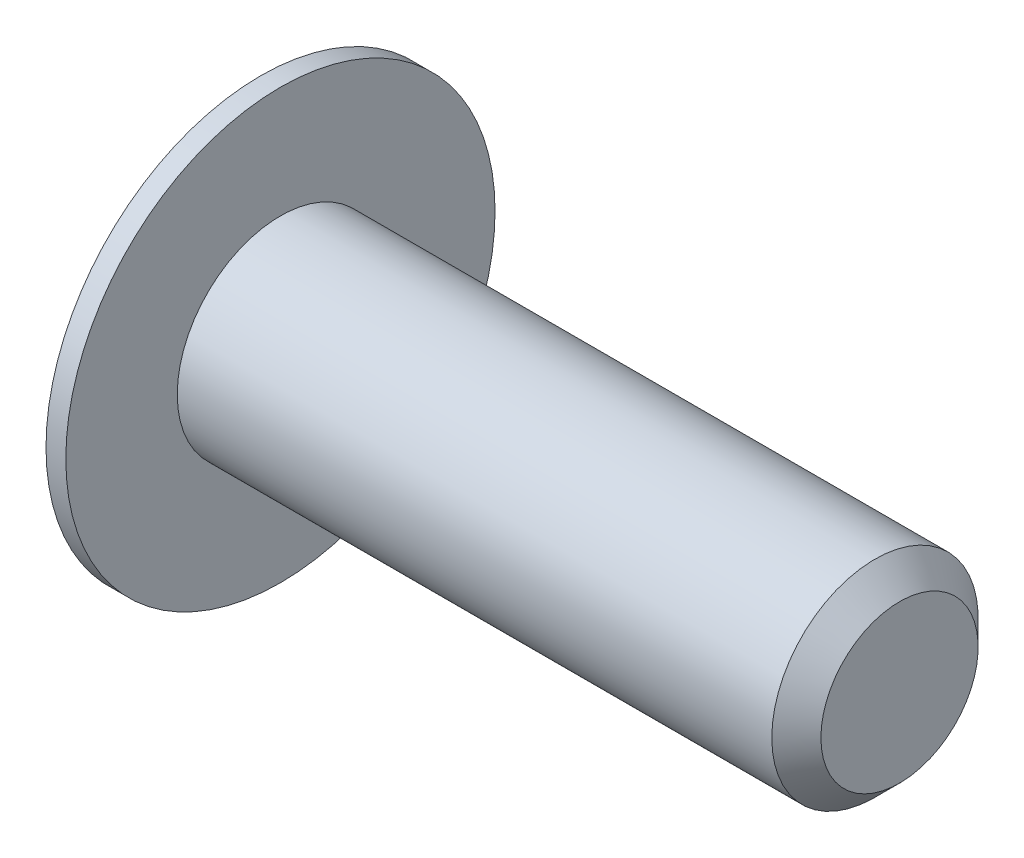
ISO-10303-21;
HEADER;
FILE_DESCRIPTION(('STEP AP214'),'2;1');
FILE_NAME('part.step','',(''),(''),'','','');
FILE_SCHEMA(('AUTOMOTIVE_DESIGN { 1 0 10303 214 1 1 1 1 }'));
ENDSEC;
DATA;
#1=APPLICATION_CONTEXT('core data for automotive mechanical design processes');
#2=APPLICATION_PROTOCOL_DEFINITION('international standard','automotive_design',2000,#1);
#3=PRODUCT_CONTEXT('',#1,'mechanical');
#4=PRODUCT('Part','Part','',(#3));
#5=PRODUCT_RELATED_PRODUCT_CATEGORY('part','',(#4));
#6=PRODUCT_DEFINITION_FORMATION('','',#4);
#7=PRODUCT_DEFINITION_CONTEXT('part definition',#1,'design');
#8=PRODUCT_DEFINITION('design','',#6,#7);
#9=PRODUCT_DEFINITION_SHAPE('','',#8);
#10=(LENGTH_UNIT() NAMED_UNIT(*) SI_UNIT(.MILLI.,.METRE.));
#11=(NAMED_UNIT(*) PLANE_ANGLE_UNIT() SI_UNIT($,.RADIAN.));
#12=(NAMED_UNIT(*) SI_UNIT($,.STERADIAN.) SOLID_ANGLE_UNIT());
#13=UNCERTAINTY_MEASURE_WITH_UNIT(LENGTH_MEASURE(1.E-05),#10,'distance_accuracy_value','');
#14=(GEOMETRIC_REPRESENTATION_CONTEXT(3) GLOBAL_UNCERTAINTY_ASSIGNED_CONTEXT((#13)) GLOBAL_UNIT_ASSIGNED_CONTEXT((#10,
#11,#12)) REPRESENTATION_CONTEXT('',''));
#15=CARTESIAN_POINT('',(0.,0.,0.));
#16=DIRECTION('',(0.,0.,1.));
#17=DIRECTION('',(1.,0.,0.));
#18=AXIS2_PLACEMENT_3D('',#15,#16,#17);
#19=CARTESIAN_POINT('',(0.,0.,0.));
#20=DIRECTION('',(-1.,0.,0.));
#21=DIRECTION('',(0.,0.,1.));
#22=AXIS2_PLACEMENT_3D('',#19,#20,#21);
#23=CYLINDRICAL_SURFACE('',#22,6.604);
#24=CARTESIAN_POINT('',(0.,0.,0.));
#25=DIRECTION('',(-1.,0.,0.));
#26=DIRECTION('',(0.,0.,1.));
#27=AXIS2_PLACEMENT_3D('',#24,#25,#26);
#28=CIRCLE('',#27,6.604);
#29=CARTESIAN_POINT('',(0.,0.,6.604));
#30=VERTEX_POINT('',#29);
#31=EDGE_CURVE('E143',#30,#30,#28,.T.);
#32=ORIENTED_EDGE('',*,*,#31,.T.);
#33=EDGE_LOOP('',(#32));
#34=FACE_BOUND('',#33,.T.);
#35=CARTESIAN_POINT('',(-0.609599999999997,0.,0.));
#36=DIRECTION('',(-1.,0.,0.));
#37=DIRECTION('',(0.,0.,1.));
#38=AXIS2_PLACEMENT_3D('',#35,#36,#37);
#39=CIRCLE('',#38,6.604);
#40=CARTESIAN_POINT('',(-0.609599999999997,0.,6.604));
#41=VERTEX_POINT('',#40);
#42=EDGE_CURVE('E134',#41,#41,#39,.T.);
#43=ORIENTED_EDGE('',*,*,#42,.F.);
#44=EDGE_LOOP('',(#43));
#45=FACE_BOUND('',#44,.T.);
#46=ADVANCED_FACE('F32',(#34,#45),#23,.T.);
#47=CARTESIAN_POINT('',(0.,6.604,0.));
#48=DIRECTION('',(1.,0.,0.));
#49=DIRECTION('',(0.,0.,-1.));
#50=AXIS2_PLACEMENT_3D('',#47,#48,#49);
#51=PLANE('',#50);
#52=CARTESIAN_POINT('',(0.,0.,0.));
#53=DIRECTION('',(1.,0.,0.));
#54=DIRECTION('',(0.,0.,-1.));
#55=AXIS2_PLACEMENT_3D('',#52,#53,#54);
#56=CIRCLE('',#55,3.175);
#57=CARTESIAN_POINT('',(0.,0.,-3.175));
#58=VERTEX_POINT('',#57);
#59=EDGE_CURVE('E140',#58,#58,#56,.T.);
#60=ORIENTED_EDGE('',*,*,#59,.F.);
#61=EDGE_LOOP('',(#60));
#62=FACE_BOUND('',#61,.T.);
#63=ORIENTED_EDGE('',*,*,#31,.F.);
#64=EDGE_LOOP('',(#63));
#65=FACE_BOUND('',#64,.T.);
#66=ADVANCED_FACE('F163',(#62,#65),#51,.T.);
#67=CARTESIAN_POINT('',(-3.048,0.,0.));
#68=DIRECTION('',(-1.,0.,0.));
#69=DIRECTION('',(0.,0.,1.));
#70=AXIS2_PLACEMENT_3D('',#67,#68,#69);
#71=PLANE('',#70);
#72=DIRECTION('',(0.,-0.499999999999994,0.866025403784442));
#73=VECTOR('',#72,1.);
#74=CARTESIAN_POINT('',(-3.048,-1.1731757469933,-2.032));
#75=LINE('',#74,#73);
#76=CARTESIAN_POINT('',(-3.048,-1.1731757469933,-2.032));
#77=VERTEX_POINT('',#76);
#78=CARTESIAN_POINT('',(-3.048,-2.3463514939866,0.));
#79=VERTEX_POINT('',#78);
#80=EDGE_CURVE('E47',#77,#79,#75,.T.);
#81=ORIENTED_EDGE('',*,*,#80,.F.);
#82=DIRECTION('',(0.,-1.,0.));
#83=VECTOR('',#82,1.);
#84=CARTESIAN_POINT('',(-3.048,1.1731757469933,-2.032));
#85=LINE('',#84,#83);
#86=CARTESIAN_POINT('',(-3.048,1.1731757469933,-2.032));
#87=VERTEX_POINT('',#86);
#88=EDGE_CURVE('E130',#87,#77,#85,.T.);
#89=ORIENTED_EDGE('',*,*,#88,.F.);
#90=DIRECTION('',(0.,-0.499999999999994,-0.866025403784442));
#91=VECTOR('',#90,1.);
#92=CARTESIAN_POINT('',(-3.048,2.3463514939866,0.));
#93=LINE('',#92,#91);
#94=CARTESIAN_POINT('',(-3.048,2.3463514939866,0.));
#95=VERTEX_POINT('',#94);
#96=EDGE_CURVE('E128',#95,#87,#93,.T.);
#97=ORIENTED_EDGE('',*,*,#96,.F.);
#98=DIRECTION('',(0.,0.499999999999994,-0.866025403784442));
#99=VECTOR('',#98,1.);
#100=CARTESIAN_POINT('',(-3.048,1.1731757469933,2.032));
#101=LINE('',#100,#99);
#102=CARTESIAN_POINT('',(-3.048,1.1731757469933,2.032));
#103=VERTEX_POINT('',#102);
#104=EDGE_CURVE('E95',#103,#95,#101,.T.);
#105=ORIENTED_EDGE('',*,*,#104,.F.);
#106=DIRECTION('',(0.,1.,0.));
#107=VECTOR('',#106,1.);
#108=CARTESIAN_POINT('',(-3.048,-1.1731757469933,2.032));
#109=LINE('',#108,#107);
#110=CARTESIAN_POINT('',(-3.048,-1.1731757469933,2.032));
#111=VERTEX_POINT('',#110);
#112=EDGE_CURVE('E124',#111,#103,#109,.T.);
#113=ORIENTED_EDGE('',*,*,#112,.F.);
#114=DIRECTION('',(0.,0.499999999999994,0.866025403784442));
#115=VECTOR('',#114,1.);
#116=CARTESIAN_POINT('',(-3.048,-2.3463514939866,0.));
#117=LINE('',#116,#115);
#118=EDGE_CURVE('E121',#79,#111,#117,.T.);
#119=ORIENTED_EDGE('',*,*,#118,.F.);
#120=EDGE_LOOP('',(#81,#89,#97,#105,#113,#119));
#121=FACE_BOUND('',#120,.T.);
#122=CARTESIAN_POINT('',(-3.048,0.,0.));
#123=DIRECTION('',(-1.,0.,0.));
#124=DIRECTION('',(0.,0.,1.));
#125=AXIS2_PLACEMENT_3D('',#122,#123,#124);
#126=CIRCLE('',#125,2.4384);
#127=CARTESIAN_POINT('',(-3.048,0.,2.4384));
#128=VERTEX_POINT('',#127);
#129=EDGE_CURVE('E179',#128,#128,#126,.T.);
#130=ORIENTED_EDGE('',*,*,#129,.T.);
#131=EDGE_LOOP('',(#130));
#132=FACE_BOUND('',#131,.T.);
#133=ADVANCED_FACE('F158',(#121,#132),#71,.T.);
#134=CARTESIAN_POINT('',(-3.048,2.4384,0.));
#135=CARTESIAN_POINT('',(-2.65656917983027,3.80682402530109,0.));
#136=CARTESIAN_POINT('',(-1.75647830409589,5.10070465916927,0.));
#137=CARTESIAN_POINT('',(-0.609600000000002,5.9436,0.));
#138=B_SPLINE_CURVE_WITH_KNOTS('',3,(#134,#135,#136,#137),.UNSPECIFIED.,.F.,.F.,(4,4),(0.,1.),.UNSPECIFIED.);
#139=CARTESIAN_POINT('',(0.,0.,0.));
#140=DIRECTION('',(-1.,0.,0.));
#141=AXIS1_PLACEMENT('',#139,#140);
#142=SURFACE_OF_REVOLUTION('',#138,#141);
#143=CARTESIAN_POINT('',(-0.609600000000002,0.,0.));
#144=DIRECTION('',(-1.,0.,0.));
#145=DIRECTION('',(0.,0.,1.));
#146=AXIS2_PLACEMENT_3D('',#143,#144,#145);
#147=CIRCLE('',#146,5.9436);
#148=CARTESIAN_POINT('',(-0.609600000000002,0.,5.9436));
#149=VERTEX_POINT('',#148);
#150=EDGE_CURVE('E177',#149,#149,#147,.T.);
#151=ORIENTED_EDGE('',*,*,#150,.T.);
#152=EDGE_LOOP('',(#151));
#153=FACE_BOUND('',#152,.T.);
#154=ORIENTED_EDGE('',*,*,#129,.F.);
#155=EDGE_LOOP('',(#154));
#156=FACE_BOUND('',#155,.T.);
#157=ADVANCED_FACE('F153',(#153,#156),#142,.F.);
#158=CARTESIAN_POINT('',(-0.6096,5.9436,0.));
#159=DIRECTION('',(-1.,0.,0.));
#160=DIRECTION('',(0.,0.,1.));
#161=AXIS2_PLACEMENT_3D('',#158,#159,#160);
#162=PLANE('',#161);
#163=ORIENTED_EDGE('',*,*,#42,.T.);
#164=EDGE_LOOP('',(#163));
#165=FACE_BOUND('',#164,.T.);
#166=ORIENTED_EDGE('',*,*,#150,.F.);
#167=EDGE_LOOP('',(#166));
#168=FACE_BOUND('',#167,.T.);
#169=ADVANCED_FACE('F157',(#165,#168),#162,.T.);
#170=CARTESIAN_POINT('',(19.05,0.,0.));
#171=DIRECTION('',(-1.,0.,0.));
#172=DIRECTION('',(0.,0.,1.));
#173=AXIS2_PLACEMENT_3D('',#170,#171,#172);
#174=CYLINDRICAL_SURFACE('',#173,3.175);
#175=CARTESIAN_POINT('',(18.29435,0.,0.));
#176=DIRECTION('',(1.,0.,0.));
#177=DIRECTION('',(0.,0.,-1.));
#178=AXIS2_PLACEMENT_3D('',#175,#176,#177);
#179=CIRCLE('',#178,3.175);
#180=CARTESIAN_POINT('',(18.29435,0.,3.175));
#181=VERTEX_POINT('',#180);
#182=EDGE_CURVE('E11',#181,#181,#179,.F.);
#183=ORIENTED_EDGE('',*,*,#182,.T.);
#184=EDGE_LOOP('',(#183));
#185=FACE_BOUND('',#184,.T.);
#186=ORIENTED_EDGE('',*,*,#59,.T.);
#187=EDGE_LOOP('',(#186));
#188=FACE_BOUND('',#187,.T.);
#189=ADVANCED_FACE('F198',(#185,#188),#174,.T.);
#190=CARTESIAN_POINT('',(19.05,0.,0.));
#191=DIRECTION('',(1.,0.,0.));
#192=DIRECTION('',(0.,0.,-1.));
#193=AXIS2_PLACEMENT_3D('',#190,#191,#192);
#194=PLANE('',#193);
#195=CARTESIAN_POINT('',(19.05,0.,0.));
#196=DIRECTION('',(1.,0.,0.));
#197=DIRECTION('',(0.,0.,-1.));
#198=AXIS2_PLACEMENT_3D('',#195,#196,#197);
#199=CIRCLE('',#198,2.41935);
#200=CARTESIAN_POINT('',(19.05,0.,2.41935));
#201=VERTEX_POINT('',#200);
#202=EDGE_CURVE('E40',#201,#201,#199,.T.);
#203=ORIENTED_EDGE('',*,*,#202,.T.);
#204=EDGE_LOOP('',(#203));
#205=FACE_BOUND('',#204,.T.);
#206=ADVANCED_FACE('F187',(#205),#194,.T.);
#207=CARTESIAN_POINT('',(-0.762,-1.1731757469933,-2.032));
#208=DIRECTION('',(0.,-0.866025403784442,-0.499999999999994));
#209=DIRECTION('',(0.,0.499999999999994,-0.866025403784442));
#210=AXIS2_PLACEMENT_3D('',#207,#208,#209);
#211=PLANE('',#210);
#212=ORIENTED_EDGE('',*,*,#80,.T.);
#213=DIRECTION('',(-1.,0.,0.));
#214=VECTOR('',#213,1.);
#215=CARTESIAN_POINT('',(-0.762,-2.3463514939866,0.));
#216=LINE('',#215,#214);
#217=CARTESIAN_POINT('',(-0.762,-2.3463514939866,0.));
#218=VERTEX_POINT('',#217);
#219=EDGE_CURVE('E77',#218,#79,#216,.T.);
#220=ORIENTED_EDGE('',*,*,#219,.F.);
#221=DIRECTION('',(0.,-0.499999999999994,0.866025403784442));
#222=VECTOR('',#221,1.);
#223=CARTESIAN_POINT('',(-0.762,-1.1731757469933,-2.032));
#224=LINE('',#223,#222);
#225=CARTESIAN_POINT('',(-0.762,-1.1731757469933,-2.032));
#226=VERTEX_POINT('',#225);
#227=EDGE_CURVE('E132',#226,#218,#224,.T.);
#228=ORIENTED_EDGE('',*,*,#227,.F.);
#229=DIRECTION('',(-1.,0.,0.));
#230=VECTOR('',#229,1.);
#231=CARTESIAN_POINT('',(-0.762,-1.1731757469933,-2.032));
#232=LINE('',#231,#230);
#233=EDGE_CURVE('E55',#226,#77,#232,.T.);
#234=ORIENTED_EDGE('',*,*,#233,.T.);
#235=EDGE_LOOP('',(#212,#220,#228,#234));
#236=FACE_BOUND('',#235,.T.);
#237=ADVANCED_FACE('F207',(#236),#211,.F.);
#238=CARTESIAN_POINT('',(-0.762,1.1731757469933,-2.032));
#239=DIRECTION('',(0.,0.,-1.));
#240=DIRECTION('',(-1.,0.,0.));
#241=AXIS2_PLACEMENT_3D('',#238,#239,#240);
#242=PLANE('',#241);
#243=ORIENTED_EDGE('',*,*,#88,.T.);
#244=ORIENTED_EDGE('',*,*,#233,.F.);
#245=DIRECTION('',(0.,-1.,0.));
#246=VECTOR('',#245,1.);
#247=CARTESIAN_POINT('',(-0.762,1.1731757469933,-2.032));
#248=LINE('',#247,#246);
#249=CARTESIAN_POINT('',(-0.762,1.1731757469933,-2.032));
#250=VERTEX_POINT('',#249);
#251=EDGE_CURVE('E107',#250,#226,#248,.T.);
#252=ORIENTED_EDGE('',*,*,#251,.F.);
#253=DIRECTION('',(-1.,0.,0.));
#254=VECTOR('',#253,1.);
#255=CARTESIAN_POINT('',(-0.762,1.1731757469933,-2.032));
#256=LINE('',#255,#254);
#257=EDGE_CURVE('E99',#250,#87,#256,.T.);
#258=ORIENTED_EDGE('',*,*,#257,.T.);
#259=EDGE_LOOP('',(#243,#244,#252,#258));
#260=FACE_BOUND('',#259,.T.);
#261=ADVANCED_FACE('F212',(#260),#242,.F.);
#262=CARTESIAN_POINT('',(-0.762,2.3463514939866,0.));
#263=DIRECTION('',(0.,0.866025403784442,-0.499999999999994));
#264=DIRECTION('',(0.,0.499999999999994,0.866025403784442));
#265=AXIS2_PLACEMENT_3D('',#262,#263,#264);
#266=PLANE('',#265);
#267=ORIENTED_EDGE('',*,*,#96,.T.);
#268=ORIENTED_EDGE('',*,*,#257,.F.);
#269=DIRECTION('',(0.,-0.499999999999994,-0.866025403784442));
#270=VECTOR('',#269,1.);
#271=CARTESIAN_POINT('',(-0.762,2.3463514939866,0.));
#272=LINE('',#271,#270);
#273=CARTESIAN_POINT('',(-0.762,2.3463514939866,0.));
#274=VERTEX_POINT('',#273);
#275=EDGE_CURVE('E103',#274,#250,#272,.T.);
#276=ORIENTED_EDGE('',*,*,#275,.F.);
#277=DIRECTION('',(-1.,0.,0.));
#278=VECTOR('',#277,1.);
#279=CARTESIAN_POINT('',(-0.762,2.3463514939866,0.));
#280=LINE('',#279,#278);
#281=EDGE_CURVE('E88',#274,#95,#280,.T.);
#282=ORIENTED_EDGE('',*,*,#281,.T.);
#283=EDGE_LOOP('',(#267,#268,#276,#282));
#284=FACE_BOUND('',#283,.T.);
#285=ADVANCED_FACE('F104',(#284),#266,.F.);
#286=CARTESIAN_POINT('',(-0.762,1.1731757469933,2.032));
#287=DIRECTION('',(0.,0.866025403784442,0.499999999999994));
#288=DIRECTION('',(0.,-0.499999999999994,0.866025403784442));
#289=AXIS2_PLACEMENT_3D('',#286,#287,#288);
#290=PLANE('',#289);
#291=ORIENTED_EDGE('',*,*,#104,.T.);
#292=ORIENTED_EDGE('',*,*,#281,.F.);
#293=DIRECTION('',(0.,0.499999999999994,-0.866025403784442));
#294=VECTOR('',#293,1.);
#295=CARTESIAN_POINT('',(-0.762,1.1731757469933,2.032));
#296=LINE('',#295,#294);
#297=CARTESIAN_POINT('',(-0.762,1.1731757469933,2.032));
#298=VERTEX_POINT('',#297);
#299=EDGE_CURVE('E92',#298,#274,#296,.T.);
#300=ORIENTED_EDGE('',*,*,#299,.F.);
#301=DIRECTION('',(-1.,0.,0.));
#302=VECTOR('',#301,1.);
#303=CARTESIAN_POINT('',(-0.762,1.1731757469933,2.032));
#304=LINE('',#303,#302);
#305=EDGE_CURVE('E100',#298,#103,#304,.T.);
#306=ORIENTED_EDGE('',*,*,#305,.T.);
#307=EDGE_LOOP('',(#291,#292,#300,#306));
#308=FACE_BOUND('',#307,.T.);
#309=ADVANCED_FACE('F90',(#308),#290,.F.);
#310=CARTESIAN_POINT('',(-0.762,-1.1731757469933,2.032));
#311=DIRECTION('',(0.,0.,1.));
#312=DIRECTION('',(1.,0.,0.));
#313=AXIS2_PLACEMENT_3D('',#310,#311,#312);
#314=PLANE('',#313);
#315=ORIENTED_EDGE('',*,*,#112,.T.);
#316=ORIENTED_EDGE('',*,*,#305,.F.);
#317=DIRECTION('',(0.,1.,0.));
#318=VECTOR('',#317,1.);
#319=CARTESIAN_POINT('',(-0.762,-1.1731757469933,2.032));
#320=LINE('',#319,#318);
#321=CARTESIAN_POINT('',(-0.762,-1.1731757469933,2.032));
#322=VERTEX_POINT('',#321);
#323=EDGE_CURVE('E113',#322,#298,#320,.T.);
#324=ORIENTED_EDGE('',*,*,#323,.F.);
#325=DIRECTION('',(-1.,0.,0.));
#326=VECTOR('',#325,1.);
#327=CARTESIAN_POINT('',(-0.762,-1.1731757469933,2.032));
#328=LINE('',#327,#326);
#329=EDGE_CURVE('E137',#322,#111,#328,.T.);
#330=ORIENTED_EDGE('',*,*,#329,.T.);
#331=EDGE_LOOP('',(#315,#316,#324,#330));
#332=FACE_BOUND('',#331,.T.);
#333=ADVANCED_FACE('F215',(#332),#314,.F.);
#334=CARTESIAN_POINT('',(-0.762,-2.3463514939866,0.));
#335=DIRECTION('',(0.,-0.866025403784442,0.499999999999994));
#336=DIRECTION('',(0.,-0.499999999999994,-0.866025403784442));
#337=AXIS2_PLACEMENT_3D('',#334,#335,#336);
#338=PLANE('',#337);
#339=ORIENTED_EDGE('',*,*,#118,.T.);
#340=ORIENTED_EDGE('',*,*,#329,.F.);
#341=DIRECTION('',(0.,0.499999999999994,0.866025403784442));
#342=VECTOR('',#341,1.);
#343=CARTESIAN_POINT('',(-0.762,-2.3463514939866,0.));
#344=LINE('',#343,#342);
#345=EDGE_CURVE('E115',#218,#322,#344,.T.);
#346=ORIENTED_EDGE('',*,*,#345,.F.);
#347=ORIENTED_EDGE('',*,*,#219,.T.);
#348=EDGE_LOOP('',(#339,#340,#346,#347));
#349=FACE_BOUND('',#348,.T.);
#350=ADVANCED_FACE('F194',(#349),#338,.F.);
#351=CARTESIAN_POINT('',(-0.762,0.,0.));
#352=DIRECTION('',(-1.,0.,0.));
#353=DIRECTION('',(0.,0.,1.));
#354=AXIS2_PLACEMENT_3D('',#351,#352,#353);
#355=PLANE('',#354);
#356=ORIENTED_EDGE('',*,*,#227,.T.);
#357=ORIENTED_EDGE('',*,*,#345,.T.);
#358=ORIENTED_EDGE('',*,*,#323,.T.);
#359=ORIENTED_EDGE('',*,*,#299,.T.);
#360=ORIENTED_EDGE('',*,*,#275,.T.);
#361=ORIENTED_EDGE('',*,*,#251,.T.);
#362=EDGE_LOOP('',(#356,#357,#358,#359,#360,#361));
#363=FACE_BOUND('',#362,.T.);
#364=ADVANCED_FACE('F110',(#363),#355,.T.);
#365=CARTESIAN_POINT('',(19.05,0.,0.));
#366=DIRECTION('',(-1.,0.,0.));
#367=DIRECTION('',(0.,0.,1.));
#368=AXIS2_PLACEMENT_3D('',#365,#366,#367);
#369=CONICAL_SURFACE('',#368,2.41935,0.785398163397446);
#370=CARTESIAN_POINT('',(18.29435,0.,3.175));
#371=CARTESIAN_POINT('',(18.3022213541667,0.,3.16712864583334));
#372=CARTESIAN_POINT('',(18.3100927083333,0.,3.15925729166667));
#373=CARTESIAN_POINT('',(18.3258354166667,0.,3.14351458333334));
#374=CARTESIAN_POINT('',(18.3337067708333,0.,3.13564322916667));
#375=CARTESIAN_POINT('',(18.3494494791667,0.,3.11990052083334));
#376=CARTESIAN_POINT('',(18.3573208333333,0.,3.11202916666667));
#377=CARTESIAN_POINT('',(18.3730635416667,0.,3.09628645833334));
#378=CARTESIAN_POINT('',(18.3809348958333,0.,3.08841510416667));
#379=CARTESIAN_POINT('',(18.3966776041667,0.,3.07267239583334));
#380=CARTESIAN_POINT('',(18.4045489583333,0.,3.06480104166667));
#381=CARTESIAN_POINT('',(18.4202916666667,0.,3.04905833333334));
#382=CARTESIAN_POINT('',(18.4281630208333,0.,3.04118697916667));
#383=CARTESIAN_POINT('',(18.4439057291667,0.,3.02544427083334));
#384=CARTESIAN_POINT('',(18.4517770833333,0.,3.01757291666667));
#385=CARTESIAN_POINT('',(18.4675197916667,0.,3.00183020833334));
#386=CARTESIAN_POINT('',(18.4753911458333,0.,2.99395885416667));
#387=CARTESIAN_POINT('',(18.4911338541667,0.,2.97821614583333));
#388=CARTESIAN_POINT('',(18.4990052083333,0.,2.97034479166667));
#389=CARTESIAN_POINT('',(18.5147479166667,0.,2.95460208333334));
#390=CARTESIAN_POINT('',(18.5226192708333,0.,2.94673072916667));
#391=CARTESIAN_POINT('',(18.5383619791667,0.,2.93098802083334));
#392=CARTESIAN_POINT('',(18.5462333333333,0.,2.92311666666667));
#393=CARTESIAN_POINT('',(18.5619760416667,0.,2.90737395833334));
#394=CARTESIAN_POINT('',(18.5698473958333,0.,2.89950260416667));
#395=CARTESIAN_POINT('',(18.5855901041667,0.,2.88375989583334));
#396=CARTESIAN_POINT('',(18.5934614583333,0.,2.87588854166667));
#397=CARTESIAN_POINT('',(18.6092041666667,0.,2.86014583333334));
#398=CARTESIAN_POINT('',(18.6170755208333,0.,2.85227447916667));
#399=CARTESIAN_POINT('',(18.6328182291667,0.,2.83653177083334));
#400=CARTESIAN_POINT('',(18.6406895833333,0.,2.82866041666667));
#401=CARTESIAN_POINT('',(18.6564322916667,0.,2.81291770833333));
#402=CARTESIAN_POINT('',(18.6643036458333,0.,2.80504635416667));
#403=CARTESIAN_POINT('',(18.6800463541667,0.,2.78930364583334));
#404=CARTESIAN_POINT('',(18.6879177083333,0.,2.78143229166667));
#405=CARTESIAN_POINT('',(18.7036604166667,0.,2.76568958333334));
#406=CARTESIAN_POINT('',(18.7115317708333,0.,2.75781822916667));
#407=CARTESIAN_POINT('',(18.7272744791667,0.,2.74207552083333));
#408=CARTESIAN_POINT('',(18.7351458333333,0.,2.73420416666667));
#409=CARTESIAN_POINT('',(18.7508885416667,0.,2.71846145833334));
#410=CARTESIAN_POINT('',(18.7587598958333,0.,2.71059010416667));
#411=CARTESIAN_POINT('',(18.7745026041667,0.,2.69484739583334));
#412=CARTESIAN_POINT('',(18.7823739583333,0.,2.68697604166667));
#413=CARTESIAN_POINT('',(18.7981166666667,0.,2.67123333333334));
#414=CARTESIAN_POINT('',(18.8059880208333,0.,2.66336197916667));
#415=CARTESIAN_POINT('',(18.8217307291667,0.,2.64761927083334));
#416=CARTESIAN_POINT('',(18.8296020833333,0.,2.63974791666667));
#417=CARTESIAN_POINT('',(18.8453447916667,0.,2.62400520833334));
#418=CARTESIAN_POINT('',(18.8532161458333,0.,2.61613385416667));
#419=CARTESIAN_POINT('',(18.8689588541667,0.,2.60039114583333));
#420=CARTESIAN_POINT('',(18.8768302083333,0.,2.59251979166667));
#421=CARTESIAN_POINT('',(18.8925729166667,0.,2.57677708333334));
#422=CARTESIAN_POINT('',(18.9004442708333,0.,2.56890572916667));
#423=CARTESIAN_POINT('',(18.9161869791667,0.,2.55316302083334));
#424=CARTESIAN_POINT('',(18.9240583333333,0.,2.54529166666667));
#425=CARTESIAN_POINT('',(18.9398010416667,0.,2.52954895833334));
#426=CARTESIAN_POINT('',(18.9476723958333,0.,2.52167760416667));
#427=CARTESIAN_POINT('',(18.9634151041667,0.,2.50593489583334));
#428=CARTESIAN_POINT('',(18.9712864583333,0.,2.49806354166667));
#429=CARTESIAN_POINT('',(18.9870291666667,0.,2.48232083333334));
#430=CARTESIAN_POINT('',(18.9949005208333,0.,2.47444947916667));
#431=CARTESIAN_POINT('',(19.0106432291667,0.,2.45870677083333));
#432=CARTESIAN_POINT('',(19.0185145833333,0.,2.45083541666667));
#433=CARTESIAN_POINT('',(19.0342572916667,0.,2.43509270833334));
#434=CARTESIAN_POINT('',(19.0421286458333,0.,2.42722135416667));
#435=CARTESIAN_POINT('',(19.05,0.,2.41935));
#436=B_SPLINE_CURVE_WITH_KNOTS('',3,(#370,#371,#372,#373,#374,#375,#376,#377,#378,#379,#380,
#381,#382,#383,#384,#385,#386,#387,#388,#389,#390,#391,#392,#393,#394,#395,#396,#397,#398,#399,
#400,#401,#402,#403,#404,#405,#406,#407,#408,#409,#410,#411,#412,#413,#414,#415,#416,#417,#418,
#419,#420,#421,#422,#423,#424,#425,#426,#427,#428,#429,#430,#431,#432,#433,#434,#435),
.UNSPECIFIED.,.F.,.F.,(4,2,2,2,2,2,2,2,2,2,2,2,2,2,2,2,2,2,2,2,2,2,2,2,2,2,2,2,2,2,2,2,4),(0.,
0.0333953274502282,0.066790654900454,0.10018598235068,0.133581309800905,0.166976637251132,
0.200371964701357,0.233767292151583,0.267162619601809,0.300557947052035,0.333953274502261,
0.367348601952486,0.400743929402712,0.434139256852938,0.467534584303164,0.50092991175339,
0.534325239203616,0.567720566653844,0.60111589410407,0.634511221554296,0.667906549004521,
0.701301876454747,0.734697203904973,0.768092531355199,0.801487858805425,0.834883186255651,
0.868278513705877,0.901673841156102,0.935069168606328,0.968464496056554,1.00185982350678,
1.03525515095701,1.06865047840723),.UNSPECIFIED.);
#437=EDGE_CURVE('BSEAM34',#181,#201,#436,.T.);
#438=ORIENTED_EDGE('',*,*,#182,.F.);
#439=ORIENTED_EDGE('',*,*,#202,.F.);
#440=ORIENTED_EDGE('',*,*,#437,.T.);
#441=ORIENTED_EDGE('',*,*,#437,.F.);
#442=EDGE_LOOP('',(#438,#440,#439,#441));
#443=FACE_BOUND('',#442,.T.);
#444=ADVANCED_FACE('F34',(#443),#369,.T.);
#445=CLOSED_SHELL('',(#46,#66,#133,#157,#169,#189,#206,#237,#261,#285,#309,#333,#350,#364,#444));
#446=MANIFOLD_SOLID_BREP('B2',#445);
#447=ADVANCED_BREP_SHAPE_REPRESENTATION('',(#18,#446),#14);
#448=SHAPE_DEFINITION_REPRESENTATION(#9,#447);
ENDSEC;
END-ISO-10303-21;
